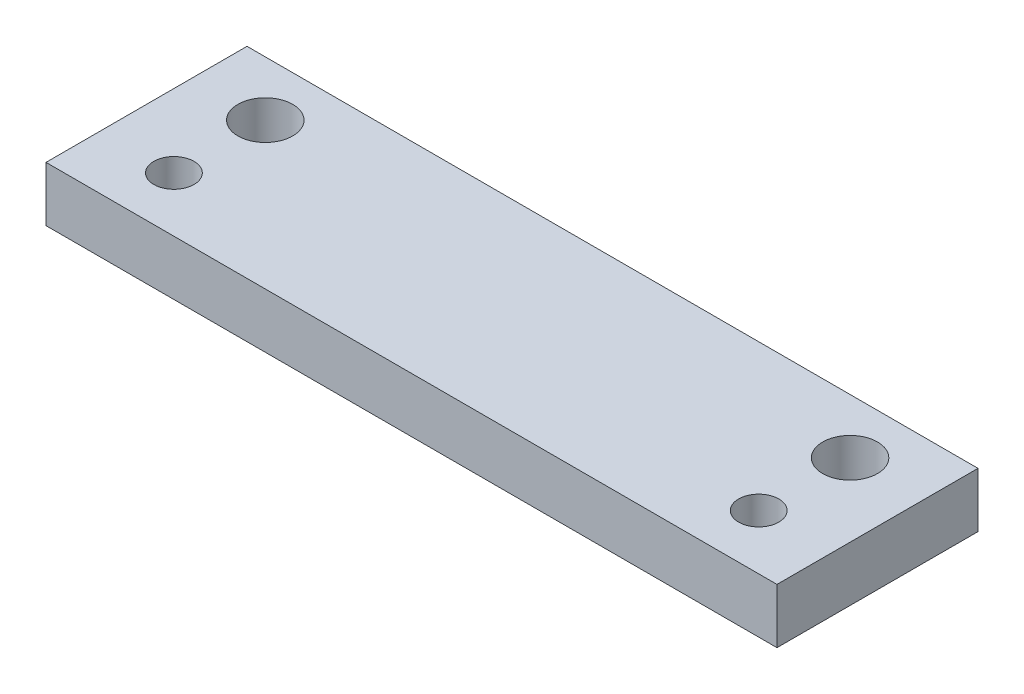
ISO-10303-21;
HEADER;
FILE_DESCRIPTION(('STEP AP214'),'2;1');
FILE_NAME('part.step','',(''),(''),'','','');
FILE_SCHEMA(('AUTOMOTIVE_DESIGN { 1 0 10303 214 1 1 1 1 }'));
ENDSEC;
DATA;
#1=APPLICATION_CONTEXT('core data for automotive mechanical design processes');
#2=APPLICATION_PROTOCOL_DEFINITION('international standard','automotive_design',2000,#1);
#3=PRODUCT_CONTEXT('',#1,'mechanical');
#4=PRODUCT('Part','Part','',(#3));
#5=PRODUCT_RELATED_PRODUCT_CATEGORY('part','',(#4));
#6=PRODUCT_DEFINITION_FORMATION('','',#4);
#7=PRODUCT_DEFINITION_CONTEXT('part definition',#1,'design');
#8=PRODUCT_DEFINITION('design','',#6,#7);
#9=PRODUCT_DEFINITION_SHAPE('','',#8);
#10=(LENGTH_UNIT() NAMED_UNIT(*) SI_UNIT(.MILLI.,.METRE.));
#11=(NAMED_UNIT(*) PLANE_ANGLE_UNIT() SI_UNIT($,.RADIAN.));
#12=(NAMED_UNIT(*) SI_UNIT($,.STERADIAN.) SOLID_ANGLE_UNIT());
#13=UNCERTAINTY_MEASURE_WITH_UNIT(LENGTH_MEASURE(1.E-05),#10,'distance_accuracy_value','');
#14=(GEOMETRIC_REPRESENTATION_CONTEXT(3) GLOBAL_UNCERTAINTY_ASSIGNED_CONTEXT((#13)) GLOBAL_UNIT_ASSIGNED_CONTEXT((#10,
#11,#12)) REPRESENTATION_CONTEXT('',''));
#15=CARTESIAN_POINT('',(0.,0.,0.));
#16=DIRECTION('',(0.,0.,1.));
#17=DIRECTION('',(1.,0.,0.));
#18=AXIS2_PLACEMENT_3D('',#15,#16,#17);
#19=CARTESIAN_POINT('',(0.,3.,0.));
#20=DIRECTION('',(0.,-1.,0.));
#21=DIRECTION('',(0.,0.,-1.));
#22=AXIS2_PLACEMENT_3D('',#19,#20,#21);
#23=PLANE('',#22);
#24=DIRECTION('',(0.,0.,1.));
#25=VECTOR('',#24,1.);
#26=CARTESIAN_POINT('',(0.,3.,0.));
#27=LINE('',#26,#25);
#28=CARTESIAN_POINT('',(0.,3.,-11.));
#29=VERTEX_POINT('',#28);
#30=CARTESIAN_POINT('',(0.,3.,0.));
#31=VERTEX_POINT('',#30);
#32=EDGE_CURVE('E98',#29,#31,#27,.T.);
#33=ORIENTED_EDGE('',*,*,#32,.T.);
#34=DIRECTION('',(1.,0.,0.));
#35=VECTOR('',#34,1.);
#36=CARTESIAN_POINT('',(0.,3.,0.));
#37=LINE('',#36,#35);
#38=CARTESIAN_POINT('',(40.,3.,0.));
#39=VERTEX_POINT('',#38);
#40=EDGE_CURVE('E93',#31,#39,#37,.T.);
#41=ORIENTED_EDGE('',*,*,#40,.T.);
#42=DIRECTION('',(0.,0.,-1.));
#43=VECTOR('',#42,1.);
#44=CARTESIAN_POINT('',(40.,3.,0.));
#45=LINE('',#44,#43);
#46=CARTESIAN_POINT('',(40.,3.,-11.));
#47=VERTEX_POINT('',#46);
#48=EDGE_CURVE('E96',#39,#47,#45,.T.);
#49=ORIENTED_EDGE('',*,*,#48,.T.);
#50=DIRECTION('',(-1.,0.,0.));
#51=VECTOR('',#50,1.);
#52=CARTESIAN_POINT('',(0.,3.,-11.));
#53=LINE('',#52,#51);
#54=EDGE_CURVE('E63',#47,#29,#53,.T.);
#55=ORIENTED_EDGE('',*,*,#54,.T.);
#56=EDGE_LOOP('',(#33,#41,#49,#55));
#57=FACE_BOUND('',#56,.T.);
#58=CARTESIAN_POINT('',(4.,3.,-3.));
#59=DIRECTION('',(0.,1.,0.));
#60=DIRECTION('',(0.,0.,1.));
#61=AXIS2_PLACEMENT_3D('',#58,#59,#60);
#62=CIRCLE('',#61,1.1);
#63=CARTESIAN_POINT('',(4.,3.,-1.9));
#64=VERTEX_POINT('',#63);
#65=EDGE_CURVE('E118',#64,#64,#62,.T.);
#66=ORIENTED_EDGE('',*,*,#65,.F.);
#67=EDGE_LOOP('',(#66));
#68=FACE_BOUND('',#67,.T.);
#69=CARTESIAN_POINT('',(36.,3.,-3.));
#70=DIRECTION('',(0.,1.,0.));
#71=DIRECTION('',(0.,0.,1.));
#72=AXIS2_PLACEMENT_3D('',#69,#70,#71);
#73=CIRCLE('',#72,1.1);
#74=CARTESIAN_POINT('',(36.,3.,-1.9));
#75=VERTEX_POINT('',#74);
#76=EDGE_CURVE('E140',#75,#75,#73,.T.);
#77=ORIENTED_EDGE('',*,*,#76,.F.);
#78=EDGE_LOOP('',(#77));
#79=FACE_BOUND('',#78,.T.);
#80=CARTESIAN_POINT('',(4.,3.,-8.));
#81=DIRECTION('',(0.,1.,0.));
#82=DIRECTION('',(0.,0.,1.));
#83=AXIS2_PLACEMENT_3D('',#80,#81,#82);
#84=CIRCLE('',#83,1.5);
#85=CARTESIAN_POINT('',(4.,3.,-6.5));
#86=VERTEX_POINT('',#85);
#87=EDGE_CURVE('E148',#86,#86,#84,.T.);
#88=ORIENTED_EDGE('',*,*,#87,.F.);
#89=EDGE_LOOP('',(#88));
#90=FACE_BOUND('',#89,.T.);
#91=CARTESIAN_POINT('',(36.,3.,-8.));
#92=DIRECTION('',(0.,1.,0.));
#93=DIRECTION('',(0.,0.,1.));
#94=AXIS2_PLACEMENT_3D('',#91,#92,#93);
#95=CIRCLE('',#94,1.5);
#96=CARTESIAN_POINT('',(36.,3.,-6.5));
#97=VERTEX_POINT('',#96);
#98=EDGE_CURVE('E156',#97,#97,#95,.T.);
#99=ORIENTED_EDGE('',*,*,#98,.F.);
#100=EDGE_LOOP('',(#99));
#101=FACE_BOUND('',#100,.T.);
#102=ADVANCED_FACE('F45',(#57,#68,#79,#90,#101),#23,.F.);
#103=CARTESIAN_POINT('',(0.,0.,0.));
#104=DIRECTION('',(0.,-1.,0.));
#105=DIRECTION('',(0.,0.,-1.));
#106=AXIS2_PLACEMENT_3D('',#103,#104,#105);
#107=PLANE('',#106);
#108=CARTESIAN_POINT('',(4.,0.,-8.));
#109=DIRECTION('',(0.,1.,0.));
#110=DIRECTION('',(0.,0.,1.));
#111=AXIS2_PLACEMENT_3D('',#108,#109,#110);
#112=CIRCLE('',#111,1.5);
#113=CARTESIAN_POINT('',(4.,0.,-6.5));
#114=VERTEX_POINT('',#113);
#115=EDGE_CURVE('E152',#114,#114,#112,.T.);
#116=ORIENTED_EDGE('',*,*,#115,.T.);
#117=EDGE_LOOP('',(#116));
#118=FACE_BOUND('',#117,.T.);
#119=CARTESIAN_POINT('',(4.,0.,-3.));
#120=DIRECTION('',(0.,1.,0.));
#121=DIRECTION('',(0.,0.,1.));
#122=AXIS2_PLACEMENT_3D('',#119,#120,#121);
#123=CIRCLE('',#122,1.1);
#124=CARTESIAN_POINT('',(4.,0.,-1.9));
#125=VERTEX_POINT('',#124);
#126=EDGE_CURVE('E136',#125,#125,#123,.T.);
#127=ORIENTED_EDGE('',*,*,#126,.T.);
#128=EDGE_LOOP('',(#127));
#129=FACE_BOUND('',#128,.T.);
#130=DIRECTION('',(0.,0.,1.));
#131=VECTOR('',#130,1.);
#132=CARTESIAN_POINT('',(0.,0.,0.));
#133=LINE('',#132,#131);
#134=CARTESIAN_POINT('',(0.,0.,-11.));
#135=VERTEX_POINT('',#134);
#136=CARTESIAN_POINT('',(0.,0.,0.));
#137=VERTEX_POINT('',#136);
#138=EDGE_CURVE('E114',#135,#137,#133,.T.);
#139=ORIENTED_EDGE('',*,*,#138,.F.);
#140=DIRECTION('',(-1.,0.,0.));
#141=VECTOR('',#140,1.);
#142=CARTESIAN_POINT('',(0.,0.,-11.));
#143=LINE('',#142,#141);
#144=CARTESIAN_POINT('',(40.,0.,-11.));
#145=VERTEX_POINT('',#144);
#146=EDGE_CURVE('E86',#145,#135,#143,.T.);
#147=ORIENTED_EDGE('',*,*,#146,.F.);
#148=DIRECTION('',(0.,0.,-1.));
#149=VECTOR('',#148,1.);
#150=CARTESIAN_POINT('',(40.,0.,0.));
#151=LINE('',#150,#149);
#152=CARTESIAN_POINT('',(40.,0.,0.));
#153=VERTEX_POINT('',#152);
#154=EDGE_CURVE('E80',#153,#145,#151,.T.);
#155=ORIENTED_EDGE('',*,*,#154,.F.);
#156=DIRECTION('',(1.,0.,0.));
#157=VECTOR('',#156,1.);
#158=CARTESIAN_POINT('',(0.,0.,0.));
#159=LINE('',#158,#157);
#160=EDGE_CURVE('E103',#137,#153,#159,.T.);
#161=ORIENTED_EDGE('',*,*,#160,.F.);
#162=EDGE_LOOP('',(#139,#147,#155,#161));
#163=FACE_BOUND('',#162,.T.);
#164=CARTESIAN_POINT('',(36.,0.,-3.));
#165=DIRECTION('',(0.,1.,0.));
#166=DIRECTION('',(0.,0.,1.));
#167=AXIS2_PLACEMENT_3D('',#164,#165,#166);
#168=CIRCLE('',#167,1.1);
#169=CARTESIAN_POINT('',(36.,0.,-1.9));
#170=VERTEX_POINT('',#169);
#171=EDGE_CURVE('E144',#170,#170,#168,.T.);
#172=ORIENTED_EDGE('',*,*,#171,.T.);
#173=EDGE_LOOP('',(#172));
#174=FACE_BOUND('',#173,.T.);
#175=CARTESIAN_POINT('',(36.,0.,-8.));
#176=DIRECTION('',(0.,1.,0.));
#177=DIRECTION('',(0.,0.,1.));
#178=AXIS2_PLACEMENT_3D('',#175,#176,#177);
#179=CIRCLE('',#178,1.5);
#180=CARTESIAN_POINT('',(36.,0.,-6.5));
#181=VERTEX_POINT('',#180);
#182=EDGE_CURVE('E160',#181,#181,#179,.T.);
#183=ORIENTED_EDGE('',*,*,#182,.T.);
#184=EDGE_LOOP('',(#183));
#185=FACE_BOUND('',#184,.T.);
#186=ADVANCED_FACE('F131',(#118,#129,#163,#174,#185),#107,.T.);
#187=CARTESIAN_POINT('',(0.,3.,0.));
#188=DIRECTION('',(1.,0.,0.));
#189=DIRECTION('',(0.,0.,-1.));
#190=AXIS2_PLACEMENT_3D('',#187,#188,#189);
#191=PLANE('',#190);
#192=ORIENTED_EDGE('',*,*,#138,.T.);
#193=DIRECTION('',(0.,-1.,0.));
#194=VECTOR('',#193,1.);
#195=CARTESIAN_POINT('',(0.,3.,0.));
#196=LINE('',#195,#194);
#197=EDGE_CURVE('E11',#31,#137,#196,.T.);
#198=ORIENTED_EDGE('',*,*,#197,.F.);
#199=ORIENTED_EDGE('',*,*,#32,.F.);
#200=DIRECTION('',(0.,-1.,0.));
#201=VECTOR('',#200,1.);
#202=CARTESIAN_POINT('',(0.,3.,-11.));
#203=LINE('',#202,#201);
#204=EDGE_CURVE('E110',#29,#135,#203,.T.);
#205=ORIENTED_EDGE('',*,*,#204,.T.);
#206=EDGE_LOOP('',(#192,#198,#199,#205));
#207=FACE_BOUND('',#206,.T.);
#208=ADVANCED_FACE('F47',(#207),#191,.F.);
#209=CARTESIAN_POINT('',(0.,3.,0.));
#210=DIRECTION('',(0.,0.,-1.));
#211=DIRECTION('',(-1.,0.,0.));
#212=AXIS2_PLACEMENT_3D('',#209,#210,#211);
#213=PLANE('',#212);
#214=ORIENTED_EDGE('',*,*,#160,.T.);
#215=DIRECTION('',(0.,-1.,0.));
#216=VECTOR('',#215,1.);
#217=CARTESIAN_POINT('',(40.,3.,0.));
#218=LINE('',#217,#216);
#219=EDGE_CURVE('E55',#39,#153,#218,.T.);
#220=ORIENTED_EDGE('',*,*,#219,.F.);
#221=ORIENTED_EDGE('',*,*,#40,.F.);
#222=ORIENTED_EDGE('',*,*,#197,.T.);
#223=EDGE_LOOP('',(#214,#220,#221,#222));
#224=FACE_BOUND('',#223,.T.);
#225=ADVANCED_FACE('F102',(#224),#213,.F.);
#226=CARTESIAN_POINT('',(40.,3.,0.));
#227=DIRECTION('',(-1.,0.,0.));
#228=DIRECTION('',(0.,0.,1.));
#229=AXIS2_PLACEMENT_3D('',#226,#227,#228);
#230=PLANE('',#229);
#231=ORIENTED_EDGE('',*,*,#154,.T.);
#232=DIRECTION('',(0.,-1.,0.));
#233=VECTOR('',#232,1.);
#234=CARTESIAN_POINT('',(40.,3.,-11.));
#235=LINE('',#234,#233);
#236=EDGE_CURVE('E105',#47,#145,#235,.T.);
#237=ORIENTED_EDGE('',*,*,#236,.F.);
#238=ORIENTED_EDGE('',*,*,#48,.F.);
#239=ORIENTED_EDGE('',*,*,#219,.T.);
#240=EDGE_LOOP('',(#231,#237,#238,#239));
#241=FACE_BOUND('',#240,.T.);
#242=ADVANCED_FACE('F106',(#241),#230,.F.);
#243=CARTESIAN_POINT('',(0.,3.,-11.));
#244=DIRECTION('',(0.,0.,1.));
#245=DIRECTION('',(1.,0.,0.));
#246=AXIS2_PLACEMENT_3D('',#243,#244,#245);
#247=PLANE('',#246);
#248=ORIENTED_EDGE('',*,*,#146,.T.);
#249=ORIENTED_EDGE('',*,*,#204,.F.);
#250=ORIENTED_EDGE('',*,*,#54,.F.);
#251=ORIENTED_EDGE('',*,*,#236,.T.);
#252=EDGE_LOOP('',(#248,#249,#250,#251));
#253=FACE_BOUND('',#252,.T.);
#254=ADVANCED_FACE('F128',(#253),#247,.F.);
#255=CARTESIAN_POINT('',(4.,3.,-3.));
#256=DIRECTION('',(0.,-1.,0.));
#257=DIRECTION('',(0.,0.,-1.));
#258=AXIS2_PLACEMENT_3D('',#255,#256,#257);
#259=CYLINDRICAL_SURFACE('',#258,1.1);
#260=ORIENTED_EDGE('',*,*,#65,.T.);
#261=EDGE_LOOP('',(#260));
#262=FACE_BOUND('',#261,.T.);
#263=ORIENTED_EDGE('',*,*,#126,.F.);
#264=EDGE_LOOP('',(#263));
#265=FACE_BOUND('',#264,.T.);
#266=ADVANCED_FACE('F179',(#262,#265),#259,.F.);
#267=CARTESIAN_POINT('',(36.,3.,-3.));
#268=DIRECTION('',(0.,-1.,0.));
#269=DIRECTION('',(0.,0.,-1.));
#270=AXIS2_PLACEMENT_3D('',#267,#268,#269);
#271=CYLINDRICAL_SURFACE('',#270,1.1);
#272=ORIENTED_EDGE('',*,*,#76,.T.);
#273=EDGE_LOOP('',(#272));
#274=FACE_BOUND('',#273,.T.);
#275=ORIENTED_EDGE('',*,*,#171,.F.);
#276=EDGE_LOOP('',(#275));
#277=FACE_BOUND('',#276,.T.);
#278=ADVANCED_FACE('F224',(#274,#277),#271,.F.);
#279=CARTESIAN_POINT('',(4.,3.,-8.));
#280=DIRECTION('',(0.,-1.,0.));
#281=DIRECTION('',(0.,0.,-1.));
#282=AXIS2_PLACEMENT_3D('',#279,#280,#281);
#283=CYLINDRICAL_SURFACE('',#282,1.5);
#284=ORIENTED_EDGE('',*,*,#87,.T.);
#285=EDGE_LOOP('',(#284));
#286=FACE_BOUND('',#285,.T.);
#287=ORIENTED_EDGE('',*,*,#115,.F.);
#288=EDGE_LOOP('',(#287));
#289=FACE_BOUND('',#288,.T.);
#290=ADVANCED_FACE('F232',(#286,#289),#283,.F.);
#291=CARTESIAN_POINT('',(36.,3.,-8.));
#292=DIRECTION('',(0.,-1.,0.));
#293=DIRECTION('',(0.,0.,-1.));
#294=AXIS2_PLACEMENT_3D('',#291,#292,#293);
#295=CYLINDRICAL_SURFACE('',#294,1.5);
#296=ORIENTED_EDGE('',*,*,#98,.T.);
#297=EDGE_LOOP('',(#296));
#298=FACE_BOUND('',#297,.T.);
#299=ORIENTED_EDGE('',*,*,#182,.F.);
#300=EDGE_LOOP('',(#299));
#301=FACE_BOUND('',#300,.T.);
#302=ADVANCED_FACE('F168',(#298,#301),#295,.F.);
#303=CLOSED_SHELL('',(#102,#186,#208,#225,#242,#254,#266,#278,#290,#302));
#304=MANIFOLD_SOLID_BREP('B2',#303);
#305=ADVANCED_BREP_SHAPE_REPRESENTATION('',(#18,#304),#14);
#306=SHAPE_DEFINITION_REPRESENTATION(#9,#305);
ENDSEC;
END-ISO-10303-21;
